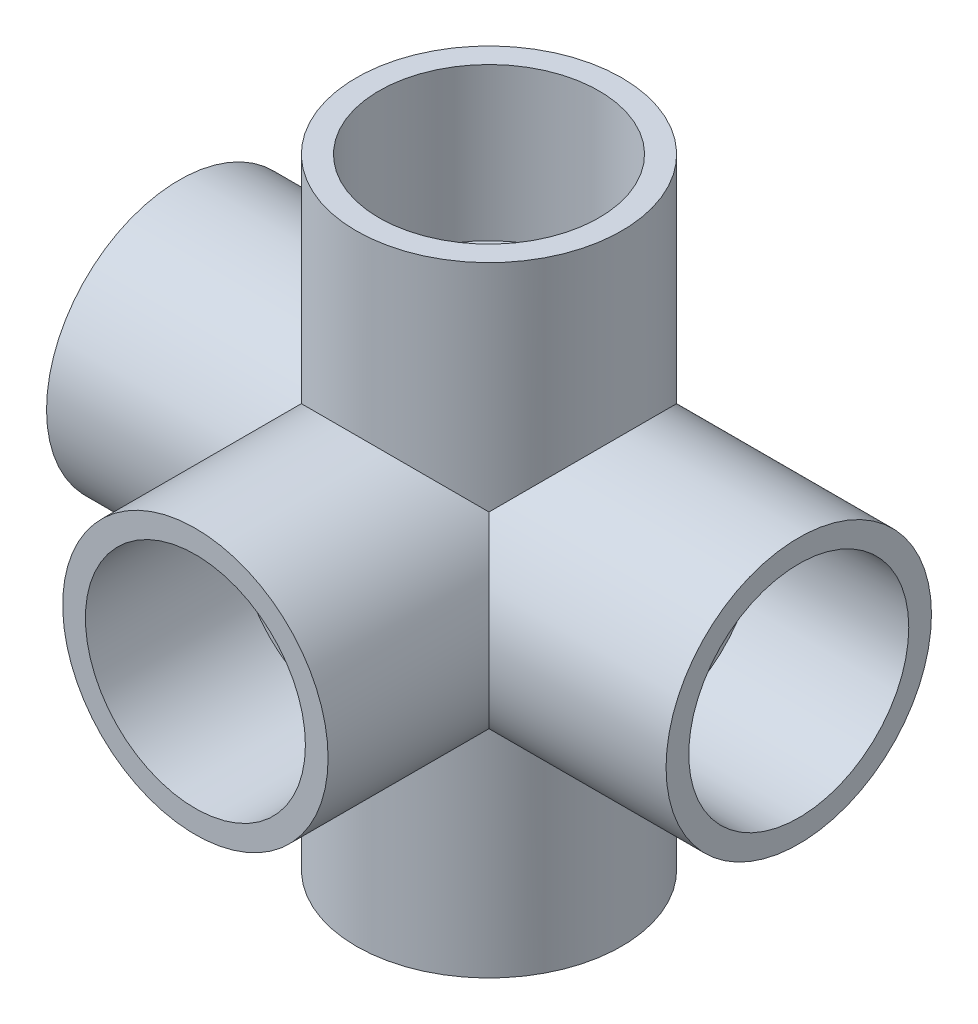
ISO-10303-21;
HEADER;
FILE_DESCRIPTION(('STEP AP214'),'2;1');
FILE_NAME('part.step','',(''),(''),'','','');
FILE_SCHEMA(('AUTOMOTIVE_DESIGN { 1 0 10303 214 1 1 1 1 }'));
ENDSEC;
DATA;
#1=APPLICATION_CONTEXT('core data for automotive mechanical design processes');
#2=APPLICATION_PROTOCOL_DEFINITION('international standard','automotive_design',2000,#1);
#3=PRODUCT_CONTEXT('',#1,'mechanical');
#4=PRODUCT('Part','Part','',(#3));
#5=PRODUCT_RELATED_PRODUCT_CATEGORY('part','',(#4));
#6=PRODUCT_DEFINITION_FORMATION('','',#4);
#7=PRODUCT_DEFINITION_CONTEXT('part definition',#1,'design');
#8=PRODUCT_DEFINITION('design','',#6,#7);
#9=PRODUCT_DEFINITION_SHAPE('','',#8);
#10=(LENGTH_UNIT() NAMED_UNIT(*) SI_UNIT(.MILLI.,.METRE.));
#11=(NAMED_UNIT(*) PLANE_ANGLE_UNIT() SI_UNIT($,.RADIAN.));
#12=(NAMED_UNIT(*) SI_UNIT($,.STERADIAN.) SOLID_ANGLE_UNIT());
#13=UNCERTAINTY_MEASURE_WITH_UNIT(LENGTH_MEASURE(1.E-05),#10,'distance_accuracy_value','');
#14=(GEOMETRIC_REPRESENTATION_CONTEXT(3) GLOBAL_UNCERTAINTY_ASSIGNED_CONTEXT((#13)) GLOBAL_UNIT_ASSIGNED_CONTEXT((#10,
#11,#12)) REPRESENTATION_CONTEXT('',''));
#15=CARTESIAN_POINT('',(0.,0.,0.));
#16=DIRECTION('',(0.,0.,1.));
#17=DIRECTION('',(1.,0.,0.));
#18=AXIS2_PLACEMENT_3D('',#15,#16,#17);
#19=CARTESIAN_POINT('',(0.,0.,42.7));
#20=DIRECTION('',(0.,0.,-1.));
#21=DIRECTION('',(-1.,0.,0.));
#22=AXIS2_PLACEMENT_3D('',#19,#20,#21);
#23=CYLINDRICAL_SURFACE('',#22,13.6);
#24=CARTESIAN_POINT('',(0.,0.,0.));
#25=DIRECTION('',(-0.707106781186547,0.,0.707106781186547));
#26=DIRECTION('',(0.707106781186547,0.,0.707106781186547));
#27=AXIS2_PLACEMENT_3D('',#24,#25,#26);
#28=ELLIPSE('',#27,19.2333044482741,13.6);
#29=CARTESIAN_POINT('',(9.61665222413705,-9.61665222413705,9.61665222413704));
#30=VERTEX_POINT('',#29);
#31=CARTESIAN_POINT('',(9.61665222413705,9.61665222413705,9.61665222413705));
#32=VERTEX_POINT('',#31);
#33=EDGE_CURVE('E73',#30,#32,#28,.T.);
#34=ORIENTED_EDGE('',*,*,#33,.F.);
#35=CARTESIAN_POINT('',(0.,0.,0.));
#36=DIRECTION('',(0.,0.707106781186547,0.707106781186547));
#37=DIRECTION('',(0.,-0.707106781186547,0.707106781186547));
#38=AXIS2_PLACEMENT_3D('',#35,#36,#37);
#39=ELLIPSE('',#38,19.2333044482741,13.6);
#40=CARTESIAN_POINT('',(-9.61665222413705,-9.61665222413705,9.61665222413705));
#41=VERTEX_POINT('',#40);
#42=EDGE_CURVE('E101',#41,#30,#39,.T.);
#43=ORIENTED_EDGE('',*,*,#42,.F.);
#44=CARTESIAN_POINT('',(0.,0.,0.));
#45=DIRECTION('',(0.707106781186547,0.,0.707106781186547));
#46=DIRECTION('',(-0.707106781186547,0.,0.707106781186547));
#47=AXIS2_PLACEMENT_3D('',#44,#45,#46);
#48=ELLIPSE('',#47,19.2333044482741,13.6);
#49=CARTESIAN_POINT('',(-9.61665222413705,9.61665222413705,9.61665222413705));
#50=VERTEX_POINT('',#49);
#51=EDGE_CURVE('E104',#50,#41,#48,.T.);
#52=ORIENTED_EDGE('',*,*,#51,.F.);
#53=CARTESIAN_POINT('',(0.,0.,0.));
#54=DIRECTION('',(0.,-0.707106781186547,0.707106781186547));
#55=DIRECTION('',(0.,0.707106781186547,0.707106781186547));
#56=AXIS2_PLACEMENT_3D('',#53,#54,#55);
#57=ELLIPSE('',#56,19.2333044482741,13.6);
#58=EDGE_CURVE('E116',#32,#50,#57,.T.);
#59=ORIENTED_EDGE('',*,*,#58,.F.);
#60=EDGE_LOOP('',(#34,#43,#52,#59));
#61=FACE_BOUND('',#60,.T.);
#62=CARTESIAN_POINT('',(0.,0.,20.5));
#63=DIRECTION('',(0.,0.,1.));
#64=DIRECTION('',(1.,0.,0.));
#65=AXIS2_PLACEMENT_3D('',#62,#63,#64);
#66=CIRCLE('',#65,13.6);
#67=CARTESIAN_POINT('',(13.6,0.,20.5));
#68=VERTEX_POINT('',#67);
#69=EDGE_CURVE('E60',#68,#68,#66,.T.);
#70=ORIENTED_EDGE('',*,*,#69,.T.);
#71=EDGE_LOOP('',(#70));
#72=FACE_BOUND('',#71,.T.);
#73=ADVANCED_FACE('F56',(#61,#72),#23,.F.);
#74=CARTESIAN_POINT('',(45.05,0.,0.));
#75=DIRECTION('',(-1.,0.,0.));
#76=DIRECTION('',(0.,0.,1.));
#77=AXIS2_PLACEMENT_3D('',#74,#75,#76);
#78=CYLINDRICAL_SURFACE('',#77,13.6);
#79=ORIENTED_EDGE('',*,*,#33,.T.);
#80=CARTESIAN_POINT('',(0.,0.,0.));
#81=DIRECTION('',(0.707106781186547,-0.707106781186547,0.));
#82=DIRECTION('',(-0.707106781186547,-0.707106781186547,0.));
#83=AXIS2_PLACEMENT_3D('',#80,#81,#82);
#84=ELLIPSE('',#83,19.2333044482741,13.6);
#85=CARTESIAN_POINT('',(0.,0.,-13.6));
#86=VERTEX_POINT('',#85);
#87=EDGE_CURVE('E12',#32,#86,#84,.F.);
#88=ORIENTED_EDGE('',*,*,#87,.T.);
#89=CARTESIAN_POINT('',(0.,0.,0.));
#90=DIRECTION('',(-0.707106781186547,-0.707106781186547,0.));
#91=DIRECTION('',(0.707106781186547,-0.707106781186547,0.));
#92=AXIS2_PLACEMENT_3D('',#89,#90,#91);
#93=ELLIPSE('',#92,19.2333044482741,13.6);
#94=EDGE_CURVE('E119',#86,#30,#93,.T.);
#95=ORIENTED_EDGE('',*,*,#94,.T.);
#96=EDGE_LOOP('',(#79,#88,#95));
#97=FACE_BOUND('',#96,.T.);
#98=CARTESIAN_POINT('',(22.85,0.,0.));
#99=DIRECTION('',(1.,0.,0.));
#100=DIRECTION('',(0.,0.,-1.));
#101=AXIS2_PLACEMENT_3D('',#98,#99,#100);
#102=CIRCLE('',#101,13.6);
#103=CARTESIAN_POINT('',(22.85,0.,-13.6));
#104=VERTEX_POINT('',#103);
#105=EDGE_CURVE('E136',#104,#104,#102,.T.);
#106=ORIENTED_EDGE('',*,*,#105,.T.);
#107=EDGE_LOOP('',(#106));
#108=FACE_BOUND('',#107,.T.);
#109=ADVANCED_FACE('F226',(#97,#108),#78,.F.);
#110=CARTESIAN_POINT('',(0.,45.05,0.));
#111=DIRECTION('',(0.,-1.,0.));
#112=DIRECTION('',(0.,0.,-1.));
#113=AXIS2_PLACEMENT_3D('',#110,#111,#112);
#114=CYLINDRICAL_SURFACE('',#113,13.6);
#115=ORIENTED_EDGE('',*,*,#58,.T.);
#116=CARTESIAN_POINT('',(0.,0.,0.));
#117=DIRECTION('',(-0.707106781186547,-0.707106781186547,0.));
#118=DIRECTION('',(0.707106781186547,-0.707106781186547,0.));
#119=AXIS2_PLACEMENT_3D('',#116,#117,#118);
#120=ELLIPSE('',#119,19.2333044482741,13.6);
#121=EDGE_CURVE('E115',#86,#50,#120,.F.);
#122=ORIENTED_EDGE('',*,*,#121,.F.);
#123=ORIENTED_EDGE('',*,*,#87,.F.);
#124=EDGE_LOOP('',(#115,#122,#123));
#125=FACE_BOUND('',#124,.T.);
#126=CARTESIAN_POINT('',(0.,22.85,0.));
#127=DIRECTION('',(0.,1.,0.));
#128=DIRECTION('',(0.,0.,1.));
#129=AXIS2_PLACEMENT_3D('',#126,#127,#128);
#130=CIRCLE('',#129,13.6);
#131=CARTESIAN_POINT('',(0.,22.85,13.6));
#132=VERTEX_POINT('',#131);
#133=EDGE_CURVE('E127',#132,#132,#130,.T.);
#134=ORIENTED_EDGE('',*,*,#133,.T.);
#135=EDGE_LOOP('',(#134));
#136=FACE_BOUND('',#135,.T.);
#137=ADVANCED_FACE('F231',(#125,#136),#114,.F.);
#138=CARTESIAN_POINT('',(0.,45.05,0.));
#139=DIRECTION('',(0.,-1.,0.));
#140=DIRECTION('',(0.,0.,-1.));
#141=AXIS2_PLACEMENT_3D('',#138,#139,#140);
#142=CYLINDRICAL_SURFACE('',#141,19.3);
#143=CARTESIAN_POINT('',(0.,45.05,0.));
#144=DIRECTION('',(0.,1.,0.));
#145=DIRECTION('',(0.,0.,1.));
#146=AXIS2_PLACEMENT_3D('',#143,#144,#145);
#147=CIRCLE('',#146,19.3);
#148=CARTESIAN_POINT('',(0.,45.05,19.3));
#149=VERTEX_POINT('',#148);
#150=EDGE_CURVE('E200',#149,#149,#147,.T.);
#151=ORIENTED_EDGE('',*,*,#150,.F.);
#152=EDGE_LOOP('',(#151));
#153=FACE_BOUND('',#152,.T.);
#154=CARTESIAN_POINT('',(0.,0.,0.));
#155=DIRECTION('',(0.,-0.707106781186548,0.707106781186547));
#156=DIRECTION('',(0.,-0.707106781186548,-0.707106781186547));
#157=AXIS2_PLACEMENT_3D('',#154,#155,#156);
#158=ELLIPSE('',#157,27.2943217538007,19.3);
#159=CARTESIAN_POINT('',(13.6471608769004,13.6471608769004,13.6471608769004));
#160=VERTEX_POINT('',#159);
#161=CARTESIAN_POINT('',(-13.6471608769004,13.6471608769004,13.6471608769004));
#162=VERTEX_POINT('',#161);
#163=EDGE_CURVE('E179',#160,#162,#158,.T.);
#164=ORIENTED_EDGE('',*,*,#163,.F.);
#165=CARTESIAN_POINT('',(0.,0.,0.));
#166=DIRECTION('',(0.707106781186547,-0.707106781186547,0.));
#167=DIRECTION('',(-0.707106781186547,-0.707106781186547,0.));
#168=AXIS2_PLACEMENT_3D('',#165,#166,#167);
#169=ELLIPSE('',#168,27.2943217538007,19.3);
#170=CARTESIAN_POINT('',(0.,0.,-19.3));
#171=VERTEX_POINT('',#170);
#172=EDGE_CURVE('E191',#171,#160,#169,.T.);
#173=ORIENTED_EDGE('',*,*,#172,.F.);
#174=CARTESIAN_POINT('',(0.,0.,0.));
#175=DIRECTION('',(-0.707106781186547,-0.707106781186547,0.));
#176=DIRECTION('',(0.707106781186547,-0.707106781186547,0.));
#177=AXIS2_PLACEMENT_3D('',#174,#175,#176);
#178=ELLIPSE('',#177,27.2943217538007,19.3);
#179=EDGE_CURVE('E194',#162,#171,#178,.T.);
#180=ORIENTED_EDGE('',*,*,#179,.F.);
#181=EDGE_LOOP('',(#164,#173,#180));
#182=FACE_BOUND('',#181,.T.);
#183=ADVANCED_FACE('F58',(#153,#182),#142,.T.);
#184=CARTESIAN_POINT('',(45.05,0.,0.));
#185=DIRECTION('',(-1.,0.,0.));
#186=DIRECTION('',(0.,0.,1.));
#187=AXIS2_PLACEMENT_3D('',#184,#185,#186);
#188=CYLINDRICAL_SURFACE('',#187,19.3);
#189=CARTESIAN_POINT('',(-45.05,0.,0.));
#190=DIRECTION('',(1.,0.,0.));
#191=DIRECTION('',(0.,0.,-1.));
#192=AXIS2_PLACEMENT_3D('',#189,#190,#191);
#193=CIRCLE('',#192,19.3);
#194=CARTESIAN_POINT('',(-45.05,0.,-19.3));
#195=VERTEX_POINT('',#194);
#196=EDGE_CURVE('E182',#195,#195,#193,.T.);
#197=ORIENTED_EDGE('',*,*,#196,.T.);
#198=EDGE_LOOP('',(#197));
#199=FACE_BOUND('',#198,.T.);
#200=CARTESIAN_POINT('',(0.,0.,0.));
#201=DIRECTION('',(-0.707106781186548,0.,-0.707106781186547));
#202=DIRECTION('',(-0.707106781186548,0.,0.707106781186547));
#203=AXIS2_PLACEMENT_3D('',#200,#201,#202);
#204=ELLIPSE('',#203,27.2943217538007,19.3);
#205=CARTESIAN_POINT('',(-13.6471608769004,-13.6471608769004,13.6471608769004));
#206=VERTEX_POINT('',#205);
#207=EDGE_CURVE('E176',#162,#206,#204,.F.);
#208=ORIENTED_EDGE('',*,*,#207,.F.);
#209=ORIENTED_EDGE('',*,*,#179,.T.);
#210=CARTESIAN_POINT('',(0.,0.,0.));
#211=DIRECTION('',(0.707106781186547,-0.707106781186547,0.));
#212=DIRECTION('',(-0.707106781186547,-0.707106781186547,0.));
#213=AXIS2_PLACEMENT_3D('',#210,#211,#212);
#214=ELLIPSE('',#213,27.2943217538007,19.3);
#215=EDGE_CURVE('E186',#171,#206,#214,.F.);
#216=ORIENTED_EDGE('',*,*,#215,.T.);
#217=EDGE_LOOP('',(#208,#209,#216));
#218=FACE_BOUND('',#217,.T.);
#219=ADVANCED_FACE('F241',(#199,#218),#188,.T.);
#220=CARTESIAN_POINT('',(-22.85,0.,0.));
#221=DIRECTION('',(1.,0.,0.));
#222=DIRECTION('',(0.,0.,-1.));
#223=AXIS2_PLACEMENT_3D('',#220,#221,#222);
#224=CIRCLE('',#223,13.6);
#225=CARTESIAN_POINT('',(-22.85,0.,-13.6));
#226=VERTEX_POINT('',#225);
#227=EDGE_CURVE('E132',#226,#226,#224,.T.);
#228=ORIENTED_EDGE('',*,*,#227,.F.);
#229=EDGE_LOOP('',(#228));
#230=FACE_BOUND('',#229,.T.);
#231=ORIENTED_EDGE('',*,*,#51,.T.);
#232=CARTESIAN_POINT('',(0.,0.,0.));
#233=DIRECTION('',(0.707106781186547,-0.707106781186547,0.));
#234=DIRECTION('',(-0.707106781186547,-0.707106781186547,0.));
#235=AXIS2_PLACEMENT_3D('',#232,#233,#234);
#236=ELLIPSE('',#235,19.2333044482741,13.6);
#237=EDGE_CURVE('E65',#41,#86,#236,.T.);
#238=ORIENTED_EDGE('',*,*,#237,.T.);
#239=ORIENTED_EDGE('',*,*,#121,.T.);
#240=EDGE_LOOP('',(#231,#238,#239));
#241=FACE_BOUND('',#240,.T.);
#242=ADVANCED_FACE('F113',(#230,#241),#78,.F.);
#243=CARTESIAN_POINT('',(45.05,0.,0.));
#244=DIRECTION('',(1.,0.,0.));
#245=DIRECTION('',(0.,0.,-1.));
#246=AXIS2_PLACEMENT_3D('',#243,#244,#245);
#247=CIRCLE('',#246,19.3);
#248=CARTESIAN_POINT('',(45.05,0.,-19.3));
#249=VERTEX_POINT('',#248);
#250=EDGE_CURVE('E183',#249,#249,#247,.T.);
#251=ORIENTED_EDGE('',*,*,#250,.F.);
#252=EDGE_LOOP('',(#251));
#253=FACE_BOUND('',#252,.T.);
#254=CARTESIAN_POINT('',(0.,0.,0.));
#255=DIRECTION('',(-0.707106781186548,0.,0.707106781186547));
#256=DIRECTION('',(-0.707106781186548,0.,-0.707106781186547));
#257=AXIS2_PLACEMENT_3D('',#254,#255,#256);
#258=ELLIPSE('',#257,27.2943217538007,19.3);
#259=CARTESIAN_POINT('',(13.6471608769004,-13.6471608769004,13.6471608769004));
#260=VERTEX_POINT('',#259);
#261=EDGE_CURVE('E173',#260,#160,#258,.T.);
#262=ORIENTED_EDGE('',*,*,#261,.F.);
#263=CARTESIAN_POINT('',(0.,0.,0.));
#264=DIRECTION('',(-0.707106781186547,-0.707106781186547,0.));
#265=DIRECTION('',(0.707106781186547,-0.707106781186547,0.));
#266=AXIS2_PLACEMENT_3D('',#263,#264,#265);
#267=ELLIPSE('',#266,27.2943217538007,19.3);
#268=EDGE_CURVE('E196',#260,#171,#267,.F.);
#269=ORIENTED_EDGE('',*,*,#268,.T.);
#270=ORIENTED_EDGE('',*,*,#172,.T.);
#271=EDGE_LOOP('',(#262,#269,#270));
#272=FACE_BOUND('',#271,.T.);
#273=ADVANCED_FACE('F240',(#253,#272),#188,.T.);
#274=CARTESIAN_POINT('',(0.,-45.05,0.));
#275=DIRECTION('',(0.,1.,0.));
#276=DIRECTION('',(0.,0.,1.));
#277=AXIS2_PLACEMENT_3D('',#274,#275,#276);
#278=CIRCLE('',#277,19.3);
#279=CARTESIAN_POINT('',(0.,-45.05,19.3));
#280=VERTEX_POINT('',#279);
#281=EDGE_CURVE('E199',#280,#280,#278,.T.);
#282=ORIENTED_EDGE('',*,*,#281,.T.);
#283=EDGE_LOOP('',(#282));
#284=FACE_BOUND('',#283,.T.);
#285=CARTESIAN_POINT('',(0.,0.,0.));
#286=DIRECTION('',(0.,-0.707106781186548,-0.707106781186547));
#287=DIRECTION('',(0.,-0.707106781186548,0.707106781186547));
#288=AXIS2_PLACEMENT_3D('',#285,#286,#287);
#289=ELLIPSE('',#288,27.2943217538007,19.3);
#290=EDGE_CURVE('E170',#206,#260,#289,.F.);
#291=ORIENTED_EDGE('',*,*,#290,.F.);
#292=ORIENTED_EDGE('',*,*,#215,.F.);
#293=ORIENTED_EDGE('',*,*,#268,.F.);
#294=EDGE_LOOP('',(#291,#292,#293));
#295=FACE_BOUND('',#294,.T.);
#296=ADVANCED_FACE('F206',(#284,#295),#142,.T.);
#297=CARTESIAN_POINT('',(0.,45.05,0.));
#298=DIRECTION('',(0.,1.,0.));
#299=DIRECTION('',(0.,0.,1.));
#300=AXIS2_PLACEMENT_3D('',#297,#298,#299);
#301=PLANE('',#300);
#302=CARTESIAN_POINT('',(0.,45.05,0.));
#303=DIRECTION('',(0.,1.,0.));
#304=DIRECTION('',(0.,0.,1.));
#305=AXIS2_PLACEMENT_3D('',#302,#303,#304);
#306=CIRCLE('',#305,16.);
#307=CARTESIAN_POINT('',(0.,45.05,16.));
#308=VERTEX_POINT('',#307);
#309=EDGE_CURVE('E134',#308,#308,#306,.T.);
#310=ORIENTED_EDGE('',*,*,#309,.F.);
#311=EDGE_LOOP('',(#310));
#312=FACE_BOUND('',#311,.T.);
#313=ORIENTED_EDGE('',*,*,#150,.T.);
#314=EDGE_LOOP('',(#313));
#315=FACE_BOUND('',#314,.T.);
#316=ADVANCED_FACE('F246',(#312,#315),#301,.T.);
#317=CARTESIAN_POINT('',(-45.05,0.,0.));
#318=DIRECTION('',(1.,0.,0.));
#319=DIRECTION('',(0.,0.,-1.));
#320=AXIS2_PLACEMENT_3D('',#317,#318,#319);
#321=PLANE('',#320);
#322=CARTESIAN_POINT('',(-45.05,0.,0.));
#323=DIRECTION('',(1.,0.,0.));
#324=DIRECTION('',(0.,0.,-1.));
#325=AXIS2_PLACEMENT_3D('',#322,#323,#324);
#326=CIRCLE('',#325,16.);
#327=CARTESIAN_POINT('',(-45.05,0.,-16.));
#328=VERTEX_POINT('',#327);
#329=EDGE_CURVE('E138',#328,#328,#326,.T.);
#330=ORIENTED_EDGE('',*,*,#329,.T.);
#331=EDGE_LOOP('',(#330));
#332=FACE_BOUND('',#331,.T.);
#333=ORIENTED_EDGE('',*,*,#196,.F.);
#334=EDGE_LOOP('',(#333));
#335=FACE_BOUND('',#334,.T.);
#336=ADVANCED_FACE('F221',(#332,#335),#321,.F.);
#337=CARTESIAN_POINT('',(45.05,0.,0.));
#338=DIRECTION('',(1.,0.,0.));
#339=DIRECTION('',(0.,0.,-1.));
#340=AXIS2_PLACEMENT_3D('',#337,#338,#339);
#341=PLANE('',#340);
#342=CARTESIAN_POINT('',(45.05,0.,0.));
#343=DIRECTION('',(1.,0.,0.));
#344=DIRECTION('',(0.,0.,-1.));
#345=AXIS2_PLACEMENT_3D('',#342,#343,#344);
#346=CIRCLE('',#345,16.);
#347=CARTESIAN_POINT('',(45.05,0.,-16.));
#348=VERTEX_POINT('',#347);
#349=EDGE_CURVE('E145',#348,#348,#346,.T.);
#350=ORIENTED_EDGE('',*,*,#349,.F.);
#351=EDGE_LOOP('',(#350));
#352=FACE_BOUND('',#351,.T.);
#353=ORIENTED_EDGE('',*,*,#250,.T.);
#354=EDGE_LOOP('',(#353));
#355=FACE_BOUND('',#354,.T.);
#356=ADVANCED_FACE('F212',(#352,#355),#341,.T.);
#357=CARTESIAN_POINT('',(0.,-45.05,0.));
#358=DIRECTION('',(0.,1.,0.));
#359=DIRECTION('',(0.,0.,1.));
#360=AXIS2_PLACEMENT_3D('',#357,#358,#359);
#361=PLANE('',#360);
#362=CARTESIAN_POINT('',(0.,-45.05,0.));
#363=DIRECTION('',(0.,1.,0.));
#364=DIRECTION('',(0.,0.,1.));
#365=AXIS2_PLACEMENT_3D('',#362,#363,#364);
#366=CIRCLE('',#365,16.);
#367=CARTESIAN_POINT('',(0.,-45.05,16.));
#368=VERTEX_POINT('',#367);
#369=EDGE_CURVE('E130',#368,#368,#366,.T.);
#370=ORIENTED_EDGE('',*,*,#369,.T.);
#371=EDGE_LOOP('',(#370));
#372=FACE_BOUND('',#371,.T.);
#373=ORIENTED_EDGE('',*,*,#281,.F.);
#374=EDGE_LOOP('',(#373));
#375=FACE_BOUND('',#374,.T.);
#376=ADVANCED_FACE('F209',(#372,#375),#361,.F.);
#377=CARTESIAN_POINT('',(0.,0.,42.7));
#378=DIRECTION('',(0.,0.,1.));
#379=DIRECTION('',(1.,0.,0.));
#380=AXIS2_PLACEMENT_3D('',#377,#378,#379);
#381=PLANE('',#380);
#382=CARTESIAN_POINT('',(0.,0.,42.7));
#383=DIRECTION('',(0.,0.,1.));
#384=DIRECTION('',(1.,0.,0.));
#385=AXIS2_PLACEMENT_3D('',#382,#383,#384);
#386=CIRCLE('',#385,16.);
#387=CARTESIAN_POINT('',(16.,0.,42.7));
#388=VERTEX_POINT('',#387);
#389=EDGE_CURVE('E152',#388,#388,#386,.T.);
#390=ORIENTED_EDGE('',*,*,#389,.F.);
#391=EDGE_LOOP('',(#390));
#392=FACE_BOUND('',#391,.T.);
#393=CARTESIAN_POINT('',(0.,0.,42.7));
#394=DIRECTION('',(0.,0.,1.));
#395=DIRECTION('',(1.,0.,0.));
#396=AXIS2_PLACEMENT_3D('',#393,#394,#395);
#397=CIRCLE('',#396,19.3);
#398=CARTESIAN_POINT('',(19.3,0.,42.7));
#399=VERTEX_POINT('',#398);
#400=EDGE_CURVE('E167',#399,#399,#397,.T.);
#401=ORIENTED_EDGE('',*,*,#400,.T.);
#402=EDGE_LOOP('',(#401));
#403=FACE_BOUND('',#402,.T.);
#404=ADVANCED_FACE('F211',(#392,#403),#381,.T.);
#405=CARTESIAN_POINT('',(0.,0.,42.7));
#406=DIRECTION('',(0.,0.,-1.));
#407=DIRECTION('',(-1.,0.,0.));
#408=AXIS2_PLACEMENT_3D('',#405,#406,#407);
#409=CYLINDRICAL_SURFACE('',#408,19.3);
#410=ORIENTED_EDGE('',*,*,#400,.F.);
#411=EDGE_LOOP('',(#410));
#412=FACE_BOUND('',#411,.T.);
#413=ORIENTED_EDGE('',*,*,#261,.T.);
#414=ORIENTED_EDGE('',*,*,#163,.T.);
#415=ORIENTED_EDGE('',*,*,#207,.T.);
#416=ORIENTED_EDGE('',*,*,#290,.T.);
#417=EDGE_LOOP('',(#413,#414,#415,#416));
#418=FACE_BOUND('',#417,.T.);
#419=ADVANCED_FACE('F218',(#412,#418),#409,.T.);
#420=CARTESIAN_POINT('',(0.,-22.85,0.));
#421=DIRECTION('',(0.,1.,0.));
#422=DIRECTION('',(0.,0.,1.));
#423=AXIS2_PLACEMENT_3D('',#420,#421,#422);
#424=CIRCLE('',#423,13.6);
#425=CARTESIAN_POINT('',(0.,-22.85,13.6));
#426=VERTEX_POINT('',#425);
#427=EDGE_CURVE('E109',#426,#426,#424,.T.);
#428=ORIENTED_EDGE('',*,*,#427,.F.);
#429=EDGE_LOOP('',(#428));
#430=FACE_BOUND('',#429,.T.);
#431=ORIENTED_EDGE('',*,*,#42,.T.);
#432=ORIENTED_EDGE('',*,*,#94,.F.);
#433=ORIENTED_EDGE('',*,*,#237,.F.);
#434=EDGE_LOOP('',(#431,#432,#433));
#435=FACE_BOUND('',#434,.T.);
#436=ADVANCED_FACE('F118',(#430,#435),#114,.F.);
#437=CARTESIAN_POINT('',(0.,-22.85,0.));
#438=DIRECTION('',(0.,-1.,0.));
#439=DIRECTION('',(0.,0.,-1.));
#440=AXIS2_PLACEMENT_3D('',#437,#438,#439);
#441=CYLINDRICAL_SURFACE('',#440,16.);
#442=CARTESIAN_POINT('',(0.,-22.85,0.));
#443=DIRECTION('',(0.,1.,0.));
#444=DIRECTION('',(0.,0.,1.));
#445=AXIS2_PLACEMENT_3D('',#442,#443,#444);
#446=CIRCLE('',#445,16.);
#447=CARTESIAN_POINT('',(0.,-22.85,16.));
#448=VERTEX_POINT('',#447);
#449=EDGE_CURVE('E126',#448,#448,#446,.T.);
#450=ORIENTED_EDGE('',*,*,#449,.T.);
#451=EDGE_LOOP('',(#450));
#452=FACE_BOUND('',#451,.T.);
#453=ORIENTED_EDGE('',*,*,#369,.F.);
#454=EDGE_LOOP('',(#453));
#455=FACE_BOUND('',#454,.T.);
#456=ADVANCED_FACE('F234',(#452,#455),#441,.F.);
#457=CARTESIAN_POINT('',(0.,-22.85,0.));
#458=DIRECTION('',(0.,1.,0.));
#459=DIRECTION('',(0.,0.,1.));
#460=AXIS2_PLACEMENT_3D('',#457,#458,#459);
#461=PLANE('',#460);
#462=ORIENTED_EDGE('',*,*,#427,.T.);
#463=EDGE_LOOP('',(#462));
#464=FACE_BOUND('',#463,.T.);
#465=ORIENTED_EDGE('',*,*,#449,.F.);
#466=EDGE_LOOP('',(#465));
#467=FACE_BOUND('',#466,.T.);
#468=ADVANCED_FACE('F317',(#464,#467),#461,.F.);
#469=CARTESIAN_POINT('',(0.,22.85,0.));
#470=DIRECTION('',(0.,1.,0.));
#471=DIRECTION('',(0.,0.,1.));
#472=AXIS2_PLACEMENT_3D('',#469,#470,#471);
#473=CYLINDRICAL_SURFACE('',#472,16.);
#474=CARTESIAN_POINT('',(0.,22.85,0.));
#475=DIRECTION('',(0.,1.,0.));
#476=DIRECTION('',(0.,0.,1.));
#477=AXIS2_PLACEMENT_3D('',#474,#475,#476);
#478=CIRCLE('',#477,16.);
#479=CARTESIAN_POINT('',(0.,22.85,16.));
#480=VERTEX_POINT('',#479);
#481=EDGE_CURVE('E131',#480,#480,#478,.T.);
#482=ORIENTED_EDGE('',*,*,#481,.F.);
#483=EDGE_LOOP('',(#482));
#484=FACE_BOUND('',#483,.T.);
#485=ORIENTED_EDGE('',*,*,#309,.T.);
#486=EDGE_LOOP('',(#485));
#487=FACE_BOUND('',#486,.T.);
#488=ADVANCED_FACE('F327',(#484,#487),#473,.F.);
#489=CARTESIAN_POINT('',(0.,22.85,0.));
#490=DIRECTION('',(0.,1.,0.));
#491=DIRECTION('',(0.,0.,1.));
#492=AXIS2_PLACEMENT_3D('',#489,#490,#491);
#493=PLANE('',#492);
#494=ORIENTED_EDGE('',*,*,#133,.F.);
#495=EDGE_LOOP('',(#494));
#496=FACE_BOUND('',#495,.T.);
#497=ORIENTED_EDGE('',*,*,#481,.T.);
#498=EDGE_LOOP('',(#497));
#499=FACE_BOUND('',#498,.T.);
#500=ADVANCED_FACE('F350',(#496,#499),#493,.T.);
#501=CARTESIAN_POINT('',(-22.85,0.,0.));
#502=DIRECTION('',(-1.,0.,0.));
#503=DIRECTION('',(0.,0.,1.));
#504=AXIS2_PLACEMENT_3D('',#501,#502,#503);
#505=CYLINDRICAL_SURFACE('',#504,16.);
#506=CARTESIAN_POINT('',(-22.85,0.,0.));
#507=DIRECTION('',(1.,0.,0.));
#508=DIRECTION('',(0.,0.,-1.));
#509=AXIS2_PLACEMENT_3D('',#506,#507,#508);
#510=CIRCLE('',#509,16.);
#511=CARTESIAN_POINT('',(-22.85,0.,-16.));
#512=VERTEX_POINT('',#511);
#513=EDGE_CURVE('E135',#512,#512,#510,.T.);
#514=ORIENTED_EDGE('',*,*,#513,.T.);
#515=EDGE_LOOP('',(#514));
#516=FACE_BOUND('',#515,.T.);
#517=ORIENTED_EDGE('',*,*,#329,.F.);
#518=EDGE_LOOP('',(#517));
#519=FACE_BOUND('',#518,.T.);
#520=ADVANCED_FACE('F360',(#516,#519),#505,.F.);
#521=CARTESIAN_POINT('',(-22.85,0.,0.));
#522=DIRECTION('',(1.,0.,0.));
#523=DIRECTION('',(0.,0.,-1.));
#524=AXIS2_PLACEMENT_3D('',#521,#522,#523);
#525=PLANE('',#524);
#526=ORIENTED_EDGE('',*,*,#227,.T.);
#527=EDGE_LOOP('',(#526));
#528=FACE_BOUND('',#527,.T.);
#529=ORIENTED_EDGE('',*,*,#513,.F.);
#530=EDGE_LOOP('',(#529));
#531=FACE_BOUND('',#530,.T.);
#532=ADVANCED_FACE('F384',(#528,#531),#525,.F.);
#533=CARTESIAN_POINT('',(22.85,0.,0.));
#534=DIRECTION('',(1.,0.,0.));
#535=DIRECTION('',(0.,0.,-1.));
#536=AXIS2_PLACEMENT_3D('',#533,#534,#535);
#537=CYLINDRICAL_SURFACE('',#536,16.);
#538=CARTESIAN_POINT('',(22.85,0.,0.));
#539=DIRECTION('',(1.,0.,0.));
#540=DIRECTION('',(0.,0.,-1.));
#541=AXIS2_PLACEMENT_3D('',#538,#539,#540);
#542=CIRCLE('',#541,16.);
#543=CARTESIAN_POINT('',(22.85,0.,-16.));
#544=VERTEX_POINT('',#543);
#545=EDGE_CURVE('E139',#544,#544,#542,.T.);
#546=ORIENTED_EDGE('',*,*,#545,.F.);
#547=EDGE_LOOP('',(#546));
#548=FACE_BOUND('',#547,.T.);
#549=ORIENTED_EDGE('',*,*,#349,.T.);
#550=EDGE_LOOP('',(#549));
#551=FACE_BOUND('',#550,.T.);
#552=ADVANCED_FACE('F395',(#548,#551),#537,.F.);
#553=CARTESIAN_POINT('',(22.85,0.,0.));
#554=DIRECTION('',(1.,0.,0.));
#555=DIRECTION('',(0.,0.,-1.));
#556=AXIS2_PLACEMENT_3D('',#553,#554,#555);
#557=PLANE('',#556);
#558=ORIENTED_EDGE('',*,*,#105,.F.);
#559=EDGE_LOOP('',(#558));
#560=FACE_BOUND('',#559,.T.);
#561=ORIENTED_EDGE('',*,*,#545,.T.);
#562=EDGE_LOOP('',(#561));
#563=FACE_BOUND('',#562,.T.);
#564=ADVANCED_FACE('F419',(#560,#563),#557,.T.);
#565=CARTESIAN_POINT('',(0.,0.,20.5));
#566=DIRECTION('',(0.,0.,1.));
#567=DIRECTION('',(1.,0.,0.));
#568=AXIS2_PLACEMENT_3D('',#565,#566,#567);
#569=CYLINDRICAL_SURFACE('',#568,16.);
#570=CARTESIAN_POINT('',(0.,0.,20.5));
#571=DIRECTION('',(0.,0.,1.));
#572=DIRECTION('',(1.,0.,0.));
#573=AXIS2_PLACEMENT_3D('',#570,#571,#572);
#574=CIRCLE('',#573,16.);
#575=CARTESIAN_POINT('',(16.,0.,20.5));
#576=VERTEX_POINT('',#575);
#577=EDGE_CURVE('E475',#576,#576,#574,.T.);
#578=ORIENTED_EDGE('',*,*,#577,.F.);
#579=EDGE_LOOP('',(#578));
#580=FACE_BOUND('',#579,.T.);
#581=ORIENTED_EDGE('',*,*,#389,.T.);
#582=EDGE_LOOP('',(#581));
#583=FACE_BOUND('',#582,.T.);
#584=ADVANCED_FACE('F428',(#580,#583),#569,.F.);
#585=CARTESIAN_POINT('',(0.,0.,20.5));
#586=DIRECTION('',(0.,0.,1.));
#587=DIRECTION('',(1.,0.,0.));
#588=AXIS2_PLACEMENT_3D('',#585,#586,#587);
#589=PLANE('',#588);
#590=ORIENTED_EDGE('',*,*,#69,.F.);
#591=EDGE_LOOP('',(#590));
#592=FACE_BOUND('',#591,.T.);
#593=ORIENTED_EDGE('',*,*,#577,.T.);
#594=EDGE_LOOP('',(#593));
#595=FACE_BOUND('',#594,.T.);
#596=ADVANCED_FACE('F453',(#592,#595),#589,.T.);
#597=CLOSED_SHELL('',(#73,#109,#137,#183,#219,#242,#273,#296,#316,#336,#356,#376,#404,#419,#436,
#456,#468,#488,#500,#520,#532,#552,#564,#584,#596));
#598=MANIFOLD_SOLID_BREP('B2',#597);
#599=ADVANCED_BREP_SHAPE_REPRESENTATION('',(#18,#598),#14);
#600=SHAPE_DEFINITION_REPRESENTATION(#9,#599);
ENDSEC;
END-ISO-10303-21;
